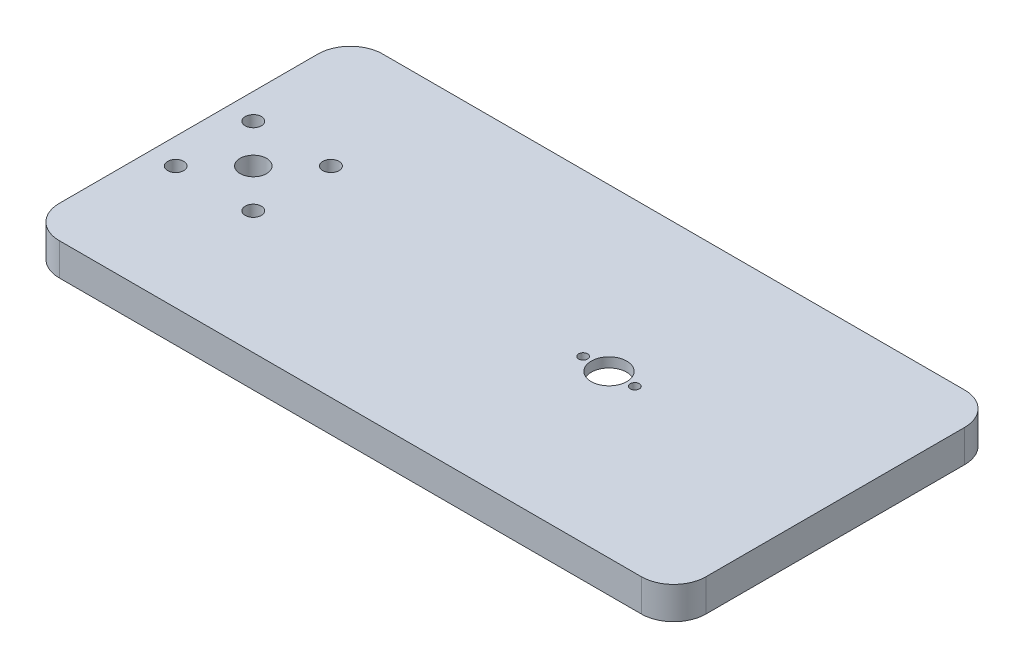
ISO-10303-21;
HEADER;
FILE_DESCRIPTION(('STEP AP214'),'2;1');
FILE_NAME('part.step','',(''),(''),'','','');
FILE_SCHEMA(('AUTOMOTIVE_DESIGN { 1 0 10303 214 1 1 1 1 }'));
ENDSEC;
DATA;
#1=APPLICATION_CONTEXT('core data for automotive mechanical design processes');
#2=APPLICATION_PROTOCOL_DEFINITION('international standard','automotive_design',2000,#1);
#3=PRODUCT_CONTEXT('',#1,'mechanical');
#4=PRODUCT('Part','Part','',(#3));
#5=PRODUCT_RELATED_PRODUCT_CATEGORY('part','',(#4));
#6=PRODUCT_DEFINITION_FORMATION('','',#4);
#7=PRODUCT_DEFINITION_CONTEXT('part definition',#1,'design');
#8=PRODUCT_DEFINITION('design','',#6,#7);
#9=PRODUCT_DEFINITION_SHAPE('','',#8);
#10=(LENGTH_UNIT() NAMED_UNIT(*) SI_UNIT(.MILLI.,.METRE.));
#11=(NAMED_UNIT(*) PLANE_ANGLE_UNIT() SI_UNIT($,.RADIAN.));
#12=(NAMED_UNIT(*) SI_UNIT($,.STERADIAN.) SOLID_ANGLE_UNIT());
#13=UNCERTAINTY_MEASURE_WITH_UNIT(LENGTH_MEASURE(1.E-05),#10,'distance_accuracy_value','');
#14=(GEOMETRIC_REPRESENTATION_CONTEXT(3) GLOBAL_UNCERTAINTY_ASSIGNED_CONTEXT((#13)) GLOBAL_UNIT_ASSIGNED_CONTEXT((#10,
#11,#12)) REPRESENTATION_CONTEXT('',''));
#15=CARTESIAN_POINT('',(0.,0.,0.));
#16=DIRECTION('',(0.,0.,1.));
#17=DIRECTION('',(1.,0.,0.));
#18=AXIS2_PLACEMENT_3D('',#15,#16,#17);
#19=CARTESIAN_POINT('',(30.,0.,0.));
#20=DIRECTION('',(0.,1.,0.));
#21=DIRECTION('',(0.,0.,1.));
#22=AXIS2_PLACEMENT_3D('',#19,#20,#21);
#23=CYLINDRICAL_SURFACE('',#22,5.5);
#24=CARTESIAN_POINT('',(30.,10.,0.));
#25=DIRECTION('',(0.,1.,0.));
#26=DIRECTION('',(0.,0.,1.));
#27=AXIS2_PLACEMENT_3D('',#24,#25,#26);
#28=CIRCLE('',#27,5.5);
#29=CARTESIAN_POINT('',(30.,10.,5.5));
#30=VERTEX_POINT('',#29);
#31=EDGE_CURVE('E272',#30,#30,#28,.T.);
#32=ORIENTED_EDGE('',*,*,#31,.T.);
#33=EDGE_LOOP('',(#32));
#34=FACE_BOUND('',#33,.T.);
#35=CARTESIAN_POINT('',(30.,7.,0.));
#36=DIRECTION('',(0.,-1.,0.));
#37=DIRECTION('',(0.,0.,-1.));
#38=AXIS2_PLACEMENT_3D('',#35,#36,#37);
#39=CIRCLE('',#38,5.5);
#40=CARTESIAN_POINT('',(30.,7.,-5.5));
#41=VERTEX_POINT('',#40);
#42=EDGE_CURVE('E278',#41,#41,#39,.F.);
#43=ORIENTED_EDGE('',*,*,#42,.F.);
#44=EDGE_LOOP('',(#43));
#45=FACE_BOUND('',#44,.T.);
#46=ADVANCED_FACE('F37',(#34,#45),#23,.F.);
#47=CARTESIAN_POINT('',(22.,0.,0.));
#48=DIRECTION('',(0.,1.,0.));
#49=DIRECTION('',(0.,0.,1.));
#50=AXIS2_PLACEMENT_3D('',#47,#48,#49);
#51=CYLINDRICAL_SURFACE('',#50,1.4);
#52=CARTESIAN_POINT('',(22.,10.,0.));
#53=DIRECTION('',(0.,1.,0.));
#54=DIRECTION('',(0.,0.,1.));
#55=AXIS2_PLACEMENT_3D('',#52,#53,#54);
#56=CIRCLE('',#55,1.4);
#57=CARTESIAN_POINT('',(22.,10.,1.4));
#58=VERTEX_POINT('',#57);
#59=EDGE_CURVE('E268',#58,#58,#56,.T.);
#60=ORIENTED_EDGE('',*,*,#59,.T.);
#61=EDGE_LOOP('',(#60));
#62=FACE_BOUND('',#61,.T.);
#63=CARTESIAN_POINT('',(22.,7.,0.));
#64=DIRECTION('',(0.,-1.,0.));
#65=DIRECTION('',(0.,0.,-1.));
#66=AXIS2_PLACEMENT_3D('',#63,#64,#65);
#67=CIRCLE('',#66,1.4);
#68=CARTESIAN_POINT('',(22.,7.,-1.4));
#69=VERTEX_POINT('',#68);
#70=EDGE_CURVE('E143',#69,#69,#67,.F.);
#71=ORIENTED_EDGE('',*,*,#70,.F.);
#72=EDGE_LOOP('',(#71));
#73=FACE_BOUND('',#72,.T.);
#74=ADVANCED_FACE('F202',(#62,#73),#51,.F.);
#75=CARTESIAN_POINT('',(38.,0.,0.));
#76=DIRECTION('',(0.,1.,0.));
#77=DIRECTION('',(0.,0.,1.));
#78=AXIS2_PLACEMENT_3D('',#75,#76,#77);
#79=CYLINDRICAL_SURFACE('',#78,1.4);
#80=CARTESIAN_POINT('',(38.,10.,0.));
#81=DIRECTION('',(0.,1.,0.));
#82=DIRECTION('',(0.,0.,1.));
#83=AXIS2_PLACEMENT_3D('',#80,#81,#82);
#84=CIRCLE('',#83,1.4);
#85=CARTESIAN_POINT('',(38.,10.,1.39999999999999));
#86=VERTEX_POINT('',#85);
#87=EDGE_CURVE('E244',#86,#86,#84,.T.);
#88=ORIENTED_EDGE('',*,*,#87,.T.);
#89=EDGE_LOOP('',(#88));
#90=FACE_BOUND('',#89,.T.);
#91=CARTESIAN_POINT('',(38.,7.,0.));
#92=DIRECTION('',(0.,-1.,0.));
#93=DIRECTION('',(0.,0.,-1.));
#94=AXIS2_PLACEMENT_3D('',#91,#92,#93);
#95=CIRCLE('',#94,1.4);
#96=CARTESIAN_POINT('',(38.,7.,-1.4));
#97=VERTEX_POINT('',#96);
#98=EDGE_CURVE('E140',#97,#97,#95,.F.);
#99=ORIENTED_EDGE('',*,*,#98,.F.);
#100=EDGE_LOOP('',(#99));
#101=FACE_BOUND('',#100,.T.);
#102=ADVANCED_FACE('F208',(#90,#101),#79,.F.);
#103=CARTESIAN_POINT('',(100.,10.,50.));
#104=DIRECTION('',(-1.,0.,0.));
#105=DIRECTION('',(0.,0.,1.));
#106=AXIS2_PLACEMENT_3D('',#103,#104,#105);
#107=PLANE('',#106);
#108=DIRECTION('',(0.,0.,-1.));
#109=VECTOR('',#108,1.);
#110=CARTESIAN_POINT('',(100.,0.,50.));
#111=LINE('',#110,#109);
#112=CARTESIAN_POINT('',(100.,0.,40.));
#113=VERTEX_POINT('',#112);
#114=CARTESIAN_POINT('',(100.,0.,-40.));
#115=VERTEX_POINT('',#114);
#116=EDGE_CURVE('E129',#113,#115,#111,.T.);
#117=ORIENTED_EDGE('',*,*,#116,.T.);
#118=DIRECTION('',(0.,-1.,0.));
#119=VECTOR('',#118,1.);
#120=CARTESIAN_POINT('',(100.,10.,-40.));
#121=LINE('',#120,#119);
#122=CARTESIAN_POINT('',(100.,10.,-40.));
#123=VERTEX_POINT('',#122);
#124=EDGE_CURVE('E107',#115,#123,#121,.F.);
#125=ORIENTED_EDGE('',*,*,#124,.T.);
#126=DIRECTION('',(0.,0.,-1.));
#127=VECTOR('',#126,1.);
#128=CARTESIAN_POINT('',(100.,10.,50.));
#129=LINE('',#128,#127);
#130=CARTESIAN_POINT('',(100.,10.,40.));
#131=VERTEX_POINT('',#130);
#132=EDGE_CURVE('E139',#131,#123,#129,.T.);
#133=ORIENTED_EDGE('',*,*,#132,.F.);
#134=DIRECTION('',(0.,-1.,0.));
#135=VECTOR('',#134,1.);
#136=CARTESIAN_POINT('',(100.,10.,40.));
#137=LINE('',#136,#135);
#138=EDGE_CURVE('E112',#131,#113,#137,.T.);
#139=ORIENTED_EDGE('',*,*,#138,.T.);
#140=EDGE_LOOP('',(#117,#125,#133,#139));
#141=FACE_BOUND('',#140,.T.);
#142=ADVANCED_FACE('F176',(#141),#107,.F.);
#143=CARTESIAN_POINT('',(-100.,10.,-50.));
#144=DIRECTION('',(0.,0.,1.));
#145=DIRECTION('',(1.,0.,0.));
#146=AXIS2_PLACEMENT_3D('',#143,#144,#145);
#147=PLANE('',#146);
#148=DIRECTION('',(-1.,0.,0.));
#149=VECTOR('',#148,1.);
#150=CARTESIAN_POINT('',(-100.,10.,-50.));
#151=LINE('',#150,#149);
#152=CARTESIAN_POINT('',(90.,10.,-50.));
#153=VERTEX_POINT('',#152);
#154=CARTESIAN_POINT('',(-90.,10.,-50.));
#155=VERTEX_POINT('',#154);
#156=EDGE_CURVE('E122',#153,#155,#151,.T.);
#157=ORIENTED_EDGE('',*,*,#156,.F.);
#158=DIRECTION('',(0.,-1.,0.));
#159=VECTOR('',#158,1.);
#160=CARTESIAN_POINT('',(90.,10.,-50.));
#161=LINE('',#160,#159);
#162=CARTESIAN_POINT('',(90.,0.,-50.));
#163=VERTEX_POINT('',#162);
#164=EDGE_CURVE('E106',#153,#163,#161,.T.);
#165=ORIENTED_EDGE('',*,*,#164,.T.);
#166=DIRECTION('',(-1.,0.,0.));
#167=VECTOR('',#166,1.);
#168=CARTESIAN_POINT('',(-100.,0.,-50.));
#169=LINE('',#168,#167);
#170=CARTESIAN_POINT('',(-90.,0.,-50.));
#171=VERTEX_POINT('',#170);
#172=EDGE_CURVE('E119',#163,#171,#169,.T.);
#173=ORIENTED_EDGE('',*,*,#172,.T.);
#174=DIRECTION('',(0.,-1.,0.));
#175=VECTOR('',#174,1.);
#176=CARTESIAN_POINT('',(-90.,10.,-50.));
#177=LINE('',#176,#175);
#178=EDGE_CURVE('E124',#171,#155,#177,.F.);
#179=ORIENTED_EDGE('',*,*,#178,.T.);
#180=EDGE_LOOP('',(#157,#165,#173,#179));
#181=FACE_BOUND('',#180,.T.);
#182=ADVANCED_FACE('F118',(#181),#147,.F.);
#183=CARTESIAN_POINT('',(-100.,10.,50.));
#184=DIRECTION('',(1.,0.,0.));
#185=DIRECTION('',(0.,0.,-1.));
#186=AXIS2_PLACEMENT_3D('',#183,#184,#185);
#187=PLANE('',#186);
#188=DIRECTION('',(0.,0.,1.));
#189=VECTOR('',#188,1.);
#190=CARTESIAN_POINT('',(-100.,10.,50.));
#191=LINE('',#190,#189);
#192=CARTESIAN_POINT('',(-100.,10.,-40.));
#193=VERTEX_POINT('',#192);
#194=CARTESIAN_POINT('',(-100.,10.,40.));
#195=VERTEX_POINT('',#194);
#196=EDGE_CURVE('E179',#193,#195,#191,.T.);
#197=ORIENTED_EDGE('',*,*,#196,.F.);
#198=DIRECTION('',(0.,-1.,0.));
#199=VECTOR('',#198,1.);
#200=CARTESIAN_POINT('',(-100.,10.,-40.));
#201=LINE('',#200,#199);
#202=CARTESIAN_POINT('',(-100.,0.,-40.));
#203=VERTEX_POINT('',#202);
#204=EDGE_CURVE('E163',#193,#203,#201,.T.);
#205=ORIENTED_EDGE('',*,*,#204,.T.);
#206=DIRECTION('',(0.,0.,1.));
#207=VECTOR('',#206,1.);
#208=CARTESIAN_POINT('',(-100.,0.,50.));
#209=LINE('',#208,#207);
#210=CARTESIAN_POINT('',(-100.,0.,40.));
#211=VERTEX_POINT('',#210);
#212=EDGE_CURVE('E128',#203,#211,#209,.T.);
#213=ORIENTED_EDGE('',*,*,#212,.T.);
#214=DIRECTION('',(0.,-1.,0.));
#215=VECTOR('',#214,1.);
#216=CARTESIAN_POINT('',(-100.,10.,40.));
#217=LINE('',#216,#215);
#218=EDGE_CURVE('E161',#211,#195,#217,.F.);
#219=ORIENTED_EDGE('',*,*,#218,.T.);
#220=EDGE_LOOP('',(#197,#205,#213,#219));
#221=FACE_BOUND('',#220,.T.);
#222=ADVANCED_FACE('F196',(#221),#187,.F.);
#223=CARTESIAN_POINT('',(-100.,10.,50.));
#224=DIRECTION('',(0.,0.,-1.));
#225=DIRECTION('',(-1.,0.,0.));
#226=AXIS2_PLACEMENT_3D('',#223,#224,#225);
#227=PLANE('',#226);
#228=DIRECTION('',(1.,0.,0.));
#229=VECTOR('',#228,1.);
#230=CARTESIAN_POINT('',(-100.,0.,50.));
#231=LINE('',#230,#229);
#232=CARTESIAN_POINT('',(-90.,0.,50.));
#233=VERTEX_POINT('',#232);
#234=CARTESIAN_POINT('',(90.,0.,50.));
#235=VERTEX_POINT('',#234);
#236=EDGE_CURVE('E132',#233,#235,#231,.T.);
#237=ORIENTED_EDGE('',*,*,#236,.T.);
#238=DIRECTION('',(0.,-1.,0.));
#239=VECTOR('',#238,1.);
#240=CARTESIAN_POINT('',(90.,10.,50.));
#241=LINE('',#240,#239);
#242=CARTESIAN_POINT('',(90.,10.,50.));
#243=VERTEX_POINT('',#242);
#244=EDGE_CURVE('E12',#235,#243,#241,.F.);
#245=ORIENTED_EDGE('',*,*,#244,.T.);
#246=DIRECTION('',(1.,0.,0.));
#247=VECTOR('',#246,1.);
#248=CARTESIAN_POINT('',(-100.,10.,50.));
#249=LINE('',#248,#247);
#250=CARTESIAN_POINT('',(-90.,10.,50.));
#251=VERTEX_POINT('',#250);
#252=EDGE_CURVE('E145',#251,#243,#249,.T.);
#253=ORIENTED_EDGE('',*,*,#252,.F.);
#254=DIRECTION('',(0.,-1.,0.));
#255=VECTOR('',#254,1.);
#256=CARTESIAN_POINT('',(-90.,10.,50.));
#257=LINE('',#256,#255);
#258=EDGE_CURVE('E45',#251,#233,#257,.T.);
#259=ORIENTED_EDGE('',*,*,#258,.T.);
#260=EDGE_LOOP('',(#237,#245,#253,#259));
#261=FACE_BOUND('',#260,.T.);
#262=ADVANCED_FACE('F168',(#261),#227,.F.);
#263=CARTESIAN_POINT('',(0.,10.,0.));
#264=DIRECTION('',(0.,-1.,0.));
#265=DIRECTION('',(0.,0.,-1.));
#266=AXIS2_PLACEMENT_3D('',#263,#264,#265);
#267=PLANE('',#266);
#268=ORIENTED_EDGE('',*,*,#87,.F.);
#269=EDGE_LOOP('',(#268));
#270=FACE_BOUND('',#269,.T.);
#271=CARTESIAN_POINT('',(-92.,10.,-12.));
#272=DIRECTION('',(0.,1.,0.));
#273=DIRECTION('',(0.,0.,1.));
#274=AXIS2_PLACEMENT_3D('',#271,#272,#273);
#275=CIRCLE('',#274,2.5);
#276=CARTESIAN_POINT('',(-92.,10.,-9.49999999999999));
#277=VERTEX_POINT('',#276);
#278=EDGE_CURVE('E249',#277,#277,#275,.T.);
#279=ORIENTED_EDGE('',*,*,#278,.F.);
#280=EDGE_LOOP('',(#279));
#281=FACE_BOUND('',#280,.T.);
#282=CARTESIAN_POINT('',(-92.,10.,12.));
#283=DIRECTION('',(0.,1.,0.));
#284=DIRECTION('',(0.,0.,1.));
#285=AXIS2_PLACEMENT_3D('',#282,#283,#284);
#286=CIRCLE('',#285,2.5);
#287=CARTESIAN_POINT('',(-92.,10.,14.5));
#288=VERTEX_POINT('',#287);
#289=EDGE_CURVE('E260',#288,#288,#286,.T.);
#290=ORIENTED_EDGE('',*,*,#289,.F.);
#291=EDGE_LOOP('',(#290));
#292=FACE_BOUND('',#291,.T.);
#293=CARTESIAN_POINT('',(-68.,10.,12.));
#294=DIRECTION('',(0.,1.,0.));
#295=DIRECTION('',(0.,0.,1.));
#296=AXIS2_PLACEMENT_3D('',#293,#294,#295);
#297=CIRCLE('',#296,2.50000000000001);
#298=CARTESIAN_POINT('',(-68.,10.,14.5));
#299=VERTEX_POINT('',#298);
#300=EDGE_CURVE('E266',#299,#299,#297,.T.);
#301=ORIENTED_EDGE('',*,*,#300,.F.);
#302=EDGE_LOOP('',(#301));
#303=FACE_BOUND('',#302,.T.);
#304=ORIENTED_EDGE('',*,*,#59,.F.);
#305=EDGE_LOOP('',(#304));
#306=FACE_BOUND('',#305,.T.);
#307=ORIENTED_EDGE('',*,*,#31,.F.);
#308=EDGE_LOOP('',(#307));
#309=FACE_BOUND('',#308,.T.);
#310=CARTESIAN_POINT('',(-80.,10.,0.));
#311=DIRECTION('',(0.,1.,0.));
#312=DIRECTION('',(0.,0.,1.));
#313=AXIS2_PLACEMENT_3D('',#310,#311,#312);
#314=CIRCLE('',#313,4.09999999999999);
#315=CARTESIAN_POINT('',(-80.,10.,4.1));
#316=VERTEX_POINT('',#315);
#317=EDGE_CURVE('E252',#316,#316,#314,.T.);
#318=ORIENTED_EDGE('',*,*,#317,.F.);
#319=EDGE_LOOP('',(#318));
#320=FACE_BOUND('',#319,.T.);
#321=CARTESIAN_POINT('',(-68.,10.,-12.));
#322=DIRECTION('',(0.,1.,0.));
#323=DIRECTION('',(0.,0.,1.));
#324=AXIS2_PLACEMENT_3D('',#321,#322,#323);
#325=CIRCLE('',#324,2.50000000000001);
#326=CARTESIAN_POINT('',(-68.,10.,-9.49999999999998));
#327=VERTEX_POINT('',#326);
#328=EDGE_CURVE('E182',#327,#327,#325,.T.);
#329=ORIENTED_EDGE('',*,*,#328,.F.);
#330=EDGE_LOOP('',(#329));
#331=FACE_BOUND('',#330,.T.);
#332=ORIENTED_EDGE('',*,*,#132,.T.);
#333=CARTESIAN_POINT('',(90.,10.,-40.));
#334=DIRECTION('',(0.,-1.,0.));
#335=DIRECTION('',(0.,0.,-1.));
#336=AXIS2_PLACEMENT_3D('',#333,#334,#335);
#337=CIRCLE('',#336,10.);
#338=EDGE_CURVE('E159',#123,#153,#337,.F.);
#339=ORIENTED_EDGE('',*,*,#338,.T.);
#340=ORIENTED_EDGE('',*,*,#156,.T.);
#341=CARTESIAN_POINT('',(-90.,10.,-40.));
#342=DIRECTION('',(0.,-1.,0.));
#343=DIRECTION('',(0.,0.,-1.));
#344=AXIS2_PLACEMENT_3D('',#341,#342,#343);
#345=CIRCLE('',#344,10.);
#346=EDGE_CURVE('E157',#155,#193,#345,.F.);
#347=ORIENTED_EDGE('',*,*,#346,.T.);
#348=ORIENTED_EDGE('',*,*,#196,.T.);
#349=CARTESIAN_POINT('',(-90.,10.,40.));
#350=DIRECTION('',(0.,-1.,0.));
#351=DIRECTION('',(0.,0.,-1.));
#352=AXIS2_PLACEMENT_3D('',#349,#350,#351);
#353=CIRCLE('',#352,10.);
#354=EDGE_CURVE('E57',#195,#251,#353,.F.);
#355=ORIENTED_EDGE('',*,*,#354,.T.);
#356=ORIENTED_EDGE('',*,*,#252,.T.);
#357=CARTESIAN_POINT('',(90.,10.,40.));
#358=DIRECTION('',(0.,-1.,0.));
#359=DIRECTION('',(0.,0.,-1.));
#360=AXIS2_PLACEMENT_3D('',#357,#358,#359);
#361=CIRCLE('',#360,10.);
#362=EDGE_CURVE('E155',#243,#131,#361,.F.);
#363=ORIENTED_EDGE('',*,*,#362,.T.);
#364=EDGE_LOOP('',(#332,#339,#340,#347,#348,#355,#356,#363));
#365=FACE_BOUND('',#364,.T.);
#366=ADVANCED_FACE('F185',(#270,#281,#292,#303,#306,#309,#320,#331,#365),#267,.F.);
#367=CARTESIAN_POINT('',(0.,0.,0.));
#368=DIRECTION('',(0.,-1.,0.));
#369=DIRECTION('',(0.,0.,-1.));
#370=AXIS2_PLACEMENT_3D('',#367,#368,#369);
#371=PLANE('',#370);
#372=CARTESIAN_POINT('',(85.,0.,35.));
#373=DIRECTION('',(0.,-1.,0.));
#374=DIRECTION('',(0.,0.,-1.));
#375=AXIS2_PLACEMENT_3D('',#372,#373,#374);
#376=CIRCLE('',#375,5.1);
#377=CARTESIAN_POINT('',(85.,0.,29.9));
#378=VERTEX_POINT('',#377);
#379=EDGE_CURVE('E305',#378,#378,#376,.T.);
#380=ORIENTED_EDGE('',*,*,#379,.F.);
#381=EDGE_LOOP('',(#380));
#382=FACE_BOUND('',#381,.T.);
#383=CARTESIAN_POINT('',(85.,0.,-35.));
#384=DIRECTION('',(0.,-1.,0.));
#385=DIRECTION('',(0.,0.,-1.));
#386=AXIS2_PLACEMENT_3D('',#383,#384,#385);
#387=CIRCLE('',#386,5.1);
#388=CARTESIAN_POINT('',(85.,0.,-40.1));
#389=VERTEX_POINT('',#388);
#390=EDGE_CURVE('E311',#389,#389,#387,.T.);
#391=ORIENTED_EDGE('',*,*,#390,.F.);
#392=EDGE_LOOP('',(#391));
#393=FACE_BOUND('',#392,.T.);
#394=CARTESIAN_POINT('',(-85.,0.,-35.));
#395=DIRECTION('',(0.,-1.,0.));
#396=DIRECTION('',(0.,0.,-1.));
#397=AXIS2_PLACEMENT_3D('',#394,#395,#396);
#398=CIRCLE('',#397,5.1);
#399=CARTESIAN_POINT('',(-85.,0.,-40.1));
#400=VERTEX_POINT('',#399);
#401=EDGE_CURVE('E317',#400,#400,#398,.T.);
#402=ORIENTED_EDGE('',*,*,#401,.F.);
#403=EDGE_LOOP('',(#402));
#404=FACE_BOUND('',#403,.T.);
#405=CARTESIAN_POINT('',(-85.,0.,35.));
#406=DIRECTION('',(0.,-1.,0.));
#407=DIRECTION('',(0.,0.,-1.));
#408=AXIS2_PLACEMENT_3D('',#405,#406,#407);
#409=CIRCLE('',#408,5.1);
#410=CARTESIAN_POINT('',(-85.,0.,29.9));
#411=VERTEX_POINT('',#410);
#412=EDGE_CURVE('E299',#411,#411,#409,.T.);
#413=ORIENTED_EDGE('',*,*,#412,.F.);
#414=EDGE_LOOP('',(#413));
#415=FACE_BOUND('',#414,.T.);
#416=CARTESIAN_POINT('',(30.,0.,0.));
#417=DIRECTION('',(0.,-1.,0.));
#418=DIRECTION('',(0.,0.,-1.));
#419=AXIS2_PLACEMENT_3D('',#416,#417,#418);
#420=CIRCLE('',#419,16.);
#421=CARTESIAN_POINT('',(30.,0.,-16.));
#422=VERTEX_POINT('',#421);
#423=EDGE_CURVE('E295',#422,#422,#420,.T.);
#424=ORIENTED_EDGE('',*,*,#423,.F.);
#425=EDGE_LOOP('',(#424));
#426=FACE_BOUND('',#425,.T.);
#427=CARTESIAN_POINT('',(-92.,0.,-12.));
#428=DIRECTION('',(0.,1.,0.));
#429=DIRECTION('',(0.,0.,1.));
#430=AXIS2_PLACEMENT_3D('',#427,#428,#429);
#431=CIRCLE('',#430,2.5);
#432=CARTESIAN_POINT('',(-92.,0.,-9.49999999999999));
#433=VERTEX_POINT('',#432);
#434=EDGE_CURVE('E246',#433,#433,#431,.T.);
#435=ORIENTED_EDGE('',*,*,#434,.T.);
#436=EDGE_LOOP('',(#435));
#437=FACE_BOUND('',#436,.T.);
#438=CARTESIAN_POINT('',(-92.,0.,12.));
#439=DIRECTION('',(0.,1.,0.));
#440=DIRECTION('',(0.,0.,1.));
#441=AXIS2_PLACEMENT_3D('',#438,#439,#440);
#442=CIRCLE('',#441,2.5);
#443=CARTESIAN_POINT('',(-92.,0.,14.5));
#444=VERTEX_POINT('',#443);
#445=EDGE_CURVE('E257',#444,#444,#442,.T.);
#446=ORIENTED_EDGE('',*,*,#445,.T.);
#447=EDGE_LOOP('',(#446));
#448=FACE_BOUND('',#447,.T.);
#449=CARTESIAN_POINT('',(-68.,0.,12.));
#450=DIRECTION('',(0.,1.,0.));
#451=DIRECTION('',(0.,0.,1.));
#452=AXIS2_PLACEMENT_3D('',#449,#450,#451);
#453=CIRCLE('',#452,2.50000000000001);
#454=CARTESIAN_POINT('',(-68.,0.,14.5));
#455=VERTEX_POINT('',#454);
#456=EDGE_CURVE('E263',#455,#455,#453,.T.);
#457=ORIENTED_EDGE('',*,*,#456,.T.);
#458=EDGE_LOOP('',(#457));
#459=FACE_BOUND('',#458,.T.);
#460=CARTESIAN_POINT('',(-80.,0.,0.));
#461=DIRECTION('',(0.,1.,0.));
#462=DIRECTION('',(0.,0.,1.));
#463=AXIS2_PLACEMENT_3D('',#460,#461,#462);
#464=CIRCLE('',#463,4.09999999999999);
#465=CARTESIAN_POINT('',(-80.,0.,4.1));
#466=VERTEX_POINT('',#465);
#467=EDGE_CURVE('E275',#466,#466,#464,.T.);
#468=ORIENTED_EDGE('',*,*,#467,.T.);
#469=EDGE_LOOP('',(#468));
#470=FACE_BOUND('',#469,.T.);
#471=CARTESIAN_POINT('',(-68.,0.,-12.));
#472=DIRECTION('',(0.,1.,0.));
#473=DIRECTION('',(0.,0.,1.));
#474=AXIS2_PLACEMENT_3D('',#471,#472,#473);
#475=CIRCLE('',#474,2.50000000000001);
#476=CARTESIAN_POINT('',(-68.,0.,-9.49999999999998));
#477=VERTEX_POINT('',#476);
#478=EDGE_CURVE('E134',#477,#477,#475,.T.);
#479=ORIENTED_EDGE('',*,*,#478,.T.);
#480=EDGE_LOOP('',(#479));
#481=FACE_BOUND('',#480,.T.);
#482=ORIENTED_EDGE('',*,*,#172,.F.);
#483=CARTESIAN_POINT('',(90.,0.,-40.));
#484=DIRECTION('',(0.,-1.,0.));
#485=DIRECTION('',(0.,0.,-1.));
#486=AXIS2_PLACEMENT_3D('',#483,#484,#485);
#487=CIRCLE('',#486,10.);
#488=EDGE_CURVE('E102',#163,#115,#487,.T.);
#489=ORIENTED_EDGE('',*,*,#488,.T.);
#490=ORIENTED_EDGE('',*,*,#116,.F.);
#491=CARTESIAN_POINT('',(90.,0.,40.));
#492=DIRECTION('',(0.,-1.,0.));
#493=DIRECTION('',(0.,0.,-1.));
#494=AXIS2_PLACEMENT_3D('',#491,#492,#493);
#495=CIRCLE('',#494,10.);
#496=EDGE_CURVE('E148',#113,#235,#495,.T.);
#497=ORIENTED_EDGE('',*,*,#496,.T.);
#498=ORIENTED_EDGE('',*,*,#236,.F.);
#499=CARTESIAN_POINT('',(-90.,0.,40.));
#500=DIRECTION('',(0.,-1.,0.));
#501=DIRECTION('',(0.,0.,-1.));
#502=AXIS2_PLACEMENT_3D('',#499,#500,#501);
#503=CIRCLE('',#502,10.);
#504=EDGE_CURVE('E123',#233,#211,#503,.T.);
#505=ORIENTED_EDGE('',*,*,#504,.T.);
#506=ORIENTED_EDGE('',*,*,#212,.F.);
#507=CARTESIAN_POINT('',(-90.,0.,-40.));
#508=DIRECTION('',(0.,-1.,0.));
#509=DIRECTION('',(0.,0.,-1.));
#510=AXIS2_PLACEMENT_3D('',#507,#508,#509);
#511=CIRCLE('',#510,10.);
#512=EDGE_CURVE('E113',#203,#171,#511,.T.);
#513=ORIENTED_EDGE('',*,*,#512,.T.);
#514=EDGE_LOOP('',(#482,#489,#490,#497,#498,#505,#506,#513));
#515=FACE_BOUND('',#514,.T.);
#516=ADVANCED_FACE('F126',(#382,#393,#404,#415,#426,#437,#448,#459,#470,#481,#515),#371,.T.);
#517=CARTESIAN_POINT('',(-68.,0.,-12.));
#518=DIRECTION('',(0.,1.,0.));
#519=DIRECTION('',(0.,0.,1.));
#520=AXIS2_PLACEMENT_3D('',#517,#518,#519);
#521=CYLINDRICAL_SURFACE('',#520,2.50000000000001);
#522=ORIENTED_EDGE('',*,*,#478,.F.);
#523=EDGE_LOOP('',(#522));
#524=FACE_BOUND('',#523,.T.);
#525=ORIENTED_EDGE('',*,*,#328,.T.);
#526=EDGE_LOOP('',(#525));
#527=FACE_BOUND('',#526,.T.);
#528=ADVANCED_FACE('F193',(#524,#527),#521,.F.);
#529=CARTESIAN_POINT('',(-80.,0.,0.));
#530=DIRECTION('',(0.,1.,0.));
#531=DIRECTION('',(0.,0.,1.));
#532=AXIS2_PLACEMENT_3D('',#529,#530,#531);
#533=CYLINDRICAL_SURFACE('',#532,4.09999999999999);
#534=ORIENTED_EDGE('',*,*,#467,.F.);
#535=EDGE_LOOP('',(#534));
#536=FACE_BOUND('',#535,.T.);
#537=ORIENTED_EDGE('',*,*,#317,.T.);
#538=EDGE_LOOP('',(#537));
#539=FACE_BOUND('',#538,.T.);
#540=ADVANCED_FACE('F215',(#536,#539),#533,.F.);
#541=CARTESIAN_POINT('',(-68.,0.,12.));
#542=DIRECTION('',(0.,1.,0.));
#543=DIRECTION('',(0.,0.,1.));
#544=AXIS2_PLACEMENT_3D('',#541,#542,#543);
#545=CYLINDRICAL_SURFACE('',#544,2.50000000000001);
#546=ORIENTED_EDGE('',*,*,#456,.F.);
#547=EDGE_LOOP('',(#546));
#548=FACE_BOUND('',#547,.T.);
#549=ORIENTED_EDGE('',*,*,#300,.T.);
#550=EDGE_LOOP('',(#549));
#551=FACE_BOUND('',#550,.T.);
#552=ADVANCED_FACE('F218',(#548,#551),#545,.F.);
#553=CARTESIAN_POINT('',(-92.,0.,12.));
#554=DIRECTION('',(0.,1.,0.));
#555=DIRECTION('',(0.,0.,1.));
#556=AXIS2_PLACEMENT_3D('',#553,#554,#555);
#557=CYLINDRICAL_SURFACE('',#556,2.5);
#558=ORIENTED_EDGE('',*,*,#445,.F.);
#559=EDGE_LOOP('',(#558));
#560=FACE_BOUND('',#559,.T.);
#561=ORIENTED_EDGE('',*,*,#289,.T.);
#562=EDGE_LOOP('',(#561));
#563=FACE_BOUND('',#562,.T.);
#564=ADVANCED_FACE('F227',(#560,#563),#557,.F.);
#565=CARTESIAN_POINT('',(-92.,0.,-12.));
#566=DIRECTION('',(0.,1.,0.));
#567=DIRECTION('',(0.,0.,1.));
#568=AXIS2_PLACEMENT_3D('',#565,#566,#567);
#569=CYLINDRICAL_SURFACE('',#568,2.5);
#570=ORIENTED_EDGE('',*,*,#434,.F.);
#571=EDGE_LOOP('',(#570));
#572=FACE_BOUND('',#571,.T.);
#573=ORIENTED_EDGE('',*,*,#278,.T.);
#574=EDGE_LOOP('',(#573));
#575=FACE_BOUND('',#574,.T.);
#576=ADVANCED_FACE('F223',(#572,#575),#569,.F.);
#577=CARTESIAN_POINT('',(0.,7.,0.));
#578=DIRECTION('',(0.,-1.,0.));
#579=DIRECTION('',(0.,0.,-1.));
#580=AXIS2_PLACEMENT_3D('',#577,#578,#579);
#581=PLANE('',#580);
#582=CARTESIAN_POINT('',(30.,7.,0.));
#583=DIRECTION('',(0.,-1.,0.));
#584=DIRECTION('',(0.,0.,-1.));
#585=AXIS2_PLACEMENT_3D('',#582,#583,#584);
#586=CIRCLE('',#585,16.);
#587=CARTESIAN_POINT('',(30.,7.,-16.));
#588=VERTEX_POINT('',#587);
#589=EDGE_CURVE('E144',#588,#588,#586,.F.);
#590=ORIENTED_EDGE('',*,*,#589,.F.);
#591=EDGE_LOOP('',(#590));
#592=FACE_BOUND('',#591,.T.);
#593=ORIENTED_EDGE('',*,*,#98,.T.);
#594=EDGE_LOOP('',(#593));
#595=FACE_BOUND('',#594,.T.);
#596=ORIENTED_EDGE('',*,*,#70,.T.);
#597=EDGE_LOOP('',(#596));
#598=FACE_BOUND('',#597,.T.);
#599=ORIENTED_EDGE('',*,*,#42,.T.);
#600=EDGE_LOOP('',(#599));
#601=FACE_BOUND('',#600,.T.);
#602=ADVANCED_FACE('F226',(#592,#595,#598,#601),#581,.T.);
#603=CARTESIAN_POINT('',(30.,55.2548339959391,0.));
#604=DIRECTION('',(0.,-1.,0.));
#605=DIRECTION('',(0.,0.,-1.));
#606=AXIS2_PLACEMENT_3D('',#603,#604,#605);
#607=CYLINDRICAL_SURFACE('',#606,16.);
#608=ORIENTED_EDGE('',*,*,#589,.T.);
#609=EDGE_LOOP('',(#608));
#610=FACE_BOUND('',#609,.T.);
#611=ORIENTED_EDGE('',*,*,#423,.T.);
#612=EDGE_LOOP('',(#611));
#613=FACE_BOUND('',#612,.T.);
#614=ADVANCED_FACE('F354',(#610,#613),#607,.F.);
#615=CARTESIAN_POINT('',(90.,10.,-40.));
#616=DIRECTION('',(0.,-1.,0.));
#617=DIRECTION('',(0.,0.,-1.));
#618=AXIS2_PLACEMENT_3D('',#615,#616,#617);
#619=CYLINDRICAL_SURFACE('',#618,10.);
#620=ORIENTED_EDGE('',*,*,#338,.F.);
#621=ORIENTED_EDGE('',*,*,#124,.F.);
#622=ORIENTED_EDGE('',*,*,#488,.F.);
#623=ORIENTED_EDGE('',*,*,#164,.F.);
#624=EDGE_LOOP('',(#620,#621,#622,#623));
#625=FACE_BOUND('',#624,.T.);
#626=ADVANCED_FACE('F105',(#625),#619,.T.);
#627=CARTESIAN_POINT('',(-90.,10.,-40.));
#628=DIRECTION('',(0.,-1.,0.));
#629=DIRECTION('',(0.,0.,-1.));
#630=AXIS2_PLACEMENT_3D('',#627,#628,#629);
#631=CYLINDRICAL_SURFACE('',#630,10.);
#632=ORIENTED_EDGE('',*,*,#346,.F.);
#633=ORIENTED_EDGE('',*,*,#178,.F.);
#634=ORIENTED_EDGE('',*,*,#512,.F.);
#635=ORIENTED_EDGE('',*,*,#204,.F.);
#636=EDGE_LOOP('',(#632,#633,#634,#635));
#637=FACE_BOUND('',#636,.T.);
#638=ADVANCED_FACE('F361',(#637),#631,.T.);
#639=CARTESIAN_POINT('',(90.,10.,40.));
#640=DIRECTION('',(0.,-1.,0.));
#641=DIRECTION('',(0.,0.,-1.));
#642=AXIS2_PLACEMENT_3D('',#639,#640,#641);
#643=CYLINDRICAL_SURFACE('',#642,10.);
#644=ORIENTED_EDGE('',*,*,#362,.F.);
#645=ORIENTED_EDGE('',*,*,#244,.F.);
#646=ORIENTED_EDGE('',*,*,#496,.F.);
#647=ORIENTED_EDGE('',*,*,#138,.F.);
#648=EDGE_LOOP('',(#644,#645,#646,#647));
#649=FACE_BOUND('',#648,.T.);
#650=ADVANCED_FACE('F173',(#649),#643,.T.);
#651=CARTESIAN_POINT('',(-90.,10.,40.));
#652=DIRECTION('',(0.,-1.,0.));
#653=DIRECTION('',(0.,0.,-1.));
#654=AXIS2_PLACEMENT_3D('',#651,#652,#653);
#655=CYLINDRICAL_SURFACE('',#654,10.);
#656=ORIENTED_EDGE('',*,*,#354,.F.);
#657=ORIENTED_EDGE('',*,*,#218,.F.);
#658=ORIENTED_EDGE('',*,*,#504,.F.);
#659=ORIENTED_EDGE('',*,*,#258,.F.);
#660=EDGE_LOOP('',(#656,#657,#658,#659));
#661=FACE_BOUND('',#660,.T.);
#662=ADVANCED_FACE('F39',(#661),#655,.T.);
#663=CARTESIAN_POINT('',(-85.,5.,35.));
#664=DIRECTION('',(0.,-1.,0.));
#665=DIRECTION('',(0.,0.,-1.));
#666=AXIS2_PLACEMENT_3D('',#663,#664,#665);
#667=CYLINDRICAL_SURFACE('',#666,5.1);
#668=CARTESIAN_POINT('',(-85.,5.,35.));
#669=DIRECTION('',(0.,-1.,0.));
#670=DIRECTION('',(0.,0.,-1.));
#671=AXIS2_PLACEMENT_3D('',#668,#669,#670);
#672=CIRCLE('',#671,5.1);
#673=CARTESIAN_POINT('',(-85.,5.,29.9));
#674=VERTEX_POINT('',#673);
#675=EDGE_CURVE('E298',#674,#674,#672,.T.);
#676=ORIENTED_EDGE('',*,*,#675,.F.);
#677=EDGE_LOOP('',(#676));
#678=FACE_BOUND('',#677,.T.);
#679=ORIENTED_EDGE('',*,*,#412,.T.);
#680=EDGE_LOOP('',(#679));
#681=FACE_BOUND('',#680,.T.);
#682=ADVANCED_FACE('F366',(#678,#681),#667,.F.);
#683=CARTESIAN_POINT('',(-85.,5.,35.));
#684=DIRECTION('',(0.,-1.,0.));
#685=DIRECTION('',(0.,0.,-1.));
#686=AXIS2_PLACEMENT_3D('',#683,#684,#685);
#687=PLANE('',#686);
#688=ORIENTED_EDGE('',*,*,#675,.T.);
#689=EDGE_LOOP('',(#688));
#690=FACE_BOUND('',#689,.T.);
#691=ADVANCED_FACE('F328',(#690),#687,.T.);
#692=CARTESIAN_POINT('',(-85.,5.,-35.));
#693=DIRECTION('',(0.,-1.,0.));
#694=DIRECTION('',(0.,0.,-1.));
#695=AXIS2_PLACEMENT_3D('',#692,#693,#694);
#696=CYLINDRICAL_SURFACE('',#695,5.1);
#697=CARTESIAN_POINT('',(-85.,5.,-35.));
#698=DIRECTION('',(0.,-1.,0.));
#699=DIRECTION('',(0.,0.,-1.));
#700=AXIS2_PLACEMENT_3D('',#697,#698,#699);
#701=CIRCLE('',#700,5.1);
#702=CARTESIAN_POINT('',(-85.,5.,-40.1));
#703=VERTEX_POINT('',#702);
#704=EDGE_CURVE('E302',#703,#703,#701,.T.);
#705=ORIENTED_EDGE('',*,*,#704,.F.);
#706=EDGE_LOOP('',(#705));
#707=FACE_BOUND('',#706,.T.);
#708=ORIENTED_EDGE('',*,*,#401,.T.);
#709=EDGE_LOOP('',(#708));
#710=FACE_BOUND('',#709,.T.);
#711=ADVANCED_FACE('F325',(#707,#710),#696,.F.);
#712=CARTESIAN_POINT('',(-85.,5.,-35.));
#713=DIRECTION('',(0.,-1.,0.));
#714=DIRECTION('',(0.,0.,-1.));
#715=AXIS2_PLACEMENT_3D('',#712,#713,#714);
#716=PLANE('',#715);
#717=ORIENTED_EDGE('',*,*,#704,.T.);
#718=EDGE_LOOP('',(#717));
#719=FACE_BOUND('',#718,.T.);
#720=ADVANCED_FACE('F323',(#719),#716,.T.);
#721=CARTESIAN_POINT('',(85.,5.,-35.));
#722=DIRECTION('',(0.,-1.,0.));
#723=DIRECTION('',(0.,0.,-1.));
#724=AXIS2_PLACEMENT_3D('',#721,#722,#723);
#725=CYLINDRICAL_SURFACE('',#724,5.1);
#726=CARTESIAN_POINT('',(85.,5.,-35.));
#727=DIRECTION('',(0.,-1.,0.));
#728=DIRECTION('',(0.,0.,-1.));
#729=AXIS2_PLACEMENT_3D('',#726,#727,#728);
#730=CIRCLE('',#729,5.1);
#731=CARTESIAN_POINT('',(85.,5.,-40.1));
#732=VERTEX_POINT('',#731);
#733=EDGE_CURVE('E314',#732,#732,#730,.T.);
#734=ORIENTED_EDGE('',*,*,#733,.F.);
#735=EDGE_LOOP('',(#734));
#736=FACE_BOUND('',#735,.T.);
#737=ORIENTED_EDGE('',*,*,#390,.T.);
#738=EDGE_LOOP('',(#737));
#739=FACE_BOUND('',#738,.T.);
#740=ADVANCED_FACE('F382',(#736,#739),#725,.F.);
#741=CARTESIAN_POINT('',(85.,5.,-35.));
#742=DIRECTION('',(0.,-1.,0.));
#743=DIRECTION('',(0.,0.,-1.));
#744=AXIS2_PLACEMENT_3D('',#741,#742,#743);
#745=PLANE('',#744);
#746=ORIENTED_EDGE('',*,*,#733,.T.);
#747=EDGE_LOOP('',(#746));
#748=FACE_BOUND('',#747,.T.);
#749=ADVANCED_FACE('F377',(#748),#745,.T.);
#750=CARTESIAN_POINT('',(85.,5.,35.));
#751=DIRECTION('',(0.,-1.,0.));
#752=DIRECTION('',(0.,0.,-1.));
#753=AXIS2_PLACEMENT_3D('',#750,#751,#752);
#754=CYLINDRICAL_SURFACE('',#753,5.1);
#755=CARTESIAN_POINT('',(85.,5.,35.));
#756=DIRECTION('',(0.,-1.,0.));
#757=DIRECTION('',(0.,0.,-1.));
#758=AXIS2_PLACEMENT_3D('',#755,#756,#757);
#759=CIRCLE('',#758,5.1);
#760=CARTESIAN_POINT('',(85.,5.,29.9));
#761=VERTEX_POINT('',#760);
#762=EDGE_CURVE('E308',#761,#761,#759,.T.);
#763=ORIENTED_EDGE('',*,*,#762,.F.);
#764=EDGE_LOOP('',(#763));
#765=FACE_BOUND('',#764,.T.);
#766=ORIENTED_EDGE('',*,*,#379,.T.);
#767=EDGE_LOOP('',(#766));
#768=FACE_BOUND('',#767,.T.);
#769=ADVANCED_FACE('F373',(#765,#768),#754,.F.);
#770=CARTESIAN_POINT('',(85.,5.,35.));
#771=DIRECTION('',(0.,-1.,0.));
#772=DIRECTION('',(0.,0.,-1.));
#773=AXIS2_PLACEMENT_3D('',#770,#771,#772);
#774=PLANE('',#773);
#775=ORIENTED_EDGE('',*,*,#762,.T.);
#776=EDGE_LOOP('',(#775));
#777=FACE_BOUND('',#776,.T.);
#778=ADVANCED_FACE('F376',(#777),#774,.T.);
#779=CLOSED_SHELL('',(#46,#74,#102,#142,#182,#222,#262,#366,#516,#528,#540,#552,#564,#576,#602,
#614,#626,#638,#650,#662,#682,#691,#711,#720,#740,#749,#769,#778));
#780=MANIFOLD_SOLID_BREP('B2',#779);
#781=ADVANCED_BREP_SHAPE_REPRESENTATION('',(#18,#780),#14);
#782=SHAPE_DEFINITION_REPRESENTATION(#9,#781);
ENDSEC;
END-ISO-10303-21;
